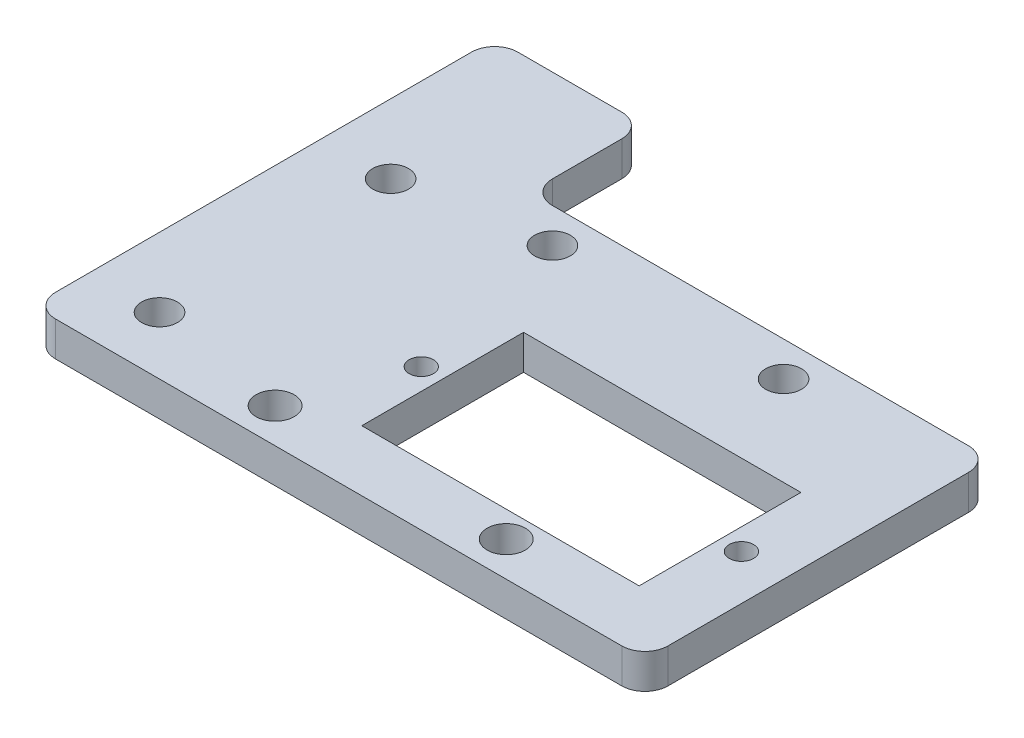
ISO-10303-21;
HEADER;
FILE_DESCRIPTION(('STEP AP214'),'2;1');
FILE_NAME('part.step','',(''),(''),'','','');
FILE_SCHEMA(('AUTOMOTIVE_DESIGN { 1 0 10303 214 1 1 1 1 }'));
ENDSEC;
DATA;
#1=APPLICATION_CONTEXT('core data for automotive mechanical design processes');
#2=APPLICATION_PROTOCOL_DEFINITION('international standard','automotive_design',2000,#1);
#3=PRODUCT_CONTEXT('',#1,'mechanical');
#4=PRODUCT('Part','Part','',(#3));
#5=PRODUCT_RELATED_PRODUCT_CATEGORY('part','',(#4));
#6=PRODUCT_DEFINITION_FORMATION('','',#4);
#7=PRODUCT_DEFINITION_CONTEXT('part definition',#1,'design');
#8=PRODUCT_DEFINITION('design','',#6,#7);
#9=PRODUCT_DEFINITION_SHAPE('','',#8);
#10=(LENGTH_UNIT() NAMED_UNIT(*) SI_UNIT(.MILLI.,.METRE.));
#11=(NAMED_UNIT(*) PLANE_ANGLE_UNIT() SI_UNIT($,.RADIAN.));
#12=(NAMED_UNIT(*) SI_UNIT($,.STERADIAN.) SOLID_ANGLE_UNIT());
#13=UNCERTAINTY_MEASURE_WITH_UNIT(LENGTH_MEASURE(1.E-05),#10,'distance_accuracy_value','');
#14=(GEOMETRIC_REPRESENTATION_CONTEXT(3) GLOBAL_UNCERTAINTY_ASSIGNED_CONTEXT((#13)) GLOBAL_UNIT_ASSIGNED_CONTEXT((#10,
#11,#12)) REPRESENTATION_CONTEXT('',''));
#15=CARTESIAN_POINT('',(0.,0.,0.));
#16=DIRECTION('',(0.,0.,1.));
#17=DIRECTION('',(1.,0.,0.));
#18=AXIS2_PLACEMENT_3D('',#15,#16,#17);
#19=CARTESIAN_POINT('',(26.5,3.,-20.));
#20=DIRECTION('',(-1.,0.,0.));
#21=DIRECTION('',(0.,0.,1.));
#22=AXIS2_PLACEMENT_3D('',#19,#20,#21);
#23=PLANE('',#22);
#24=DIRECTION('',(0.,0.,-1.));
#25=VECTOR('',#24,1.);
#26=CARTESIAN_POINT('',(26.5,3.,-20.));
#27=LINE('',#26,#25);
#28=CARTESIAN_POINT('',(26.5,3.,18.));
#29=VERTEX_POINT('',#28);
#30=CARTESIAN_POINT('',(26.5,3.,-8.00000000000001));
#31=VERTEX_POINT('',#30);
#32=EDGE_CURVE('E224',#29,#31,#27,.T.);
#33=ORIENTED_EDGE('',*,*,#32,.F.);
#34=DIRECTION('',(0.,-1.,0.));
#35=VECTOR('',#34,1.);
#36=CARTESIAN_POINT('',(26.5,3.,18.));
#37=LINE('',#36,#35);
#38=CARTESIAN_POINT('',(26.5,0.,18.));
#39=VERTEX_POINT('',#38);
#40=EDGE_CURVE('E285',#29,#39,#37,.T.);
#41=ORIENTED_EDGE('',*,*,#40,.T.);
#42=DIRECTION('',(0.,0.,-1.));
#43=VECTOR('',#42,1.);
#44=CARTESIAN_POINT('',(26.5,0.,-20.));
#45=LINE('',#44,#43);
#46=CARTESIAN_POINT('',(26.5,0.,-8.00000000000001));
#47=VERTEX_POINT('',#46);
#48=EDGE_CURVE('E223',#39,#47,#45,.T.);
#49=ORIENTED_EDGE('',*,*,#48,.T.);
#50=DIRECTION('',(0.,-1.,0.));
#51=VECTOR('',#50,1.);
#52=CARTESIAN_POINT('',(26.5,3.,-8.00000000000001));
#53=LINE('',#52,#51);
#54=EDGE_CURVE('E283',#47,#31,#53,.F.);
#55=ORIENTED_EDGE('',*,*,#54,.T.);
#56=EDGE_LOOP('',(#33,#41,#49,#55));
#57=FACE_BOUND('',#56,.T.);
#58=ADVANCED_FACE('F39',(#57),#23,.F.);
#59=CARTESIAN_POINT('',(-26.5,3.,-20.));
#60=DIRECTION('',(0.,0.,1.));
#61=DIRECTION('',(1.,0.,0.));
#62=AXIS2_PLACEMENT_3D('',#59,#60,#61);
#63=PLANE('',#62);
#64=DIRECTION('',(-1.,0.,0.));
#65=VECTOR('',#64,1.);
#66=CARTESIAN_POINT('',(-26.5,3.,-20.));
#67=LINE('',#66,#65);
#68=CARTESIAN_POINT('',(-15.5,3.,-20.));
#69=VERTEX_POINT('',#68);
#70=CARTESIAN_POINT('',(-24.5,3.,-20.));
#71=VERTEX_POINT('',#70);
#72=EDGE_CURVE('E226',#69,#71,#67,.T.);
#73=ORIENTED_EDGE('',*,*,#72,.F.);
#74=DIRECTION('',(0.,-1.,0.));
#75=VECTOR('',#74,1.);
#76=CARTESIAN_POINT('',(-15.5,3.,-20.));
#77=LINE('',#76,#75);
#78=CARTESIAN_POINT('',(-15.5,0.,-20.));
#79=VERTEX_POINT('',#78);
#80=EDGE_CURVE('E299',#69,#79,#77,.T.);
#81=ORIENTED_EDGE('',*,*,#80,.T.);
#82=DIRECTION('',(-1.,0.,0.));
#83=VECTOR('',#82,1.);
#84=CARTESIAN_POINT('',(-26.5,0.,-20.));
#85=LINE('',#84,#83);
#86=CARTESIAN_POINT('',(-24.5,0.,-20.));
#87=VERTEX_POINT('',#86);
#88=EDGE_CURVE('E239',#79,#87,#85,.T.);
#89=ORIENTED_EDGE('',*,*,#88,.T.);
#90=DIRECTION('',(0.,-1.,0.));
#91=VECTOR('',#90,1.);
#92=CARTESIAN_POINT('',(-24.5,3.,-20.));
#93=LINE('',#92,#91);
#94=EDGE_CURVE('E297',#87,#71,#93,.F.);
#95=ORIENTED_EDGE('',*,*,#94,.T.);
#96=EDGE_LOOP('',(#73,#81,#89,#95));
#97=FACE_BOUND('',#96,.T.);
#98=ADVANCED_FACE('F364',(#97),#63,.F.);
#99=CARTESIAN_POINT('',(-26.5,3.,-20.));
#100=DIRECTION('',(1.,0.,0.));
#101=DIRECTION('',(0.,0.,-1.));
#102=AXIS2_PLACEMENT_3D('',#99,#100,#101);
#103=PLANE('',#102);
#104=DIRECTION('',(0.,0.,1.));
#105=VECTOR('',#104,1.);
#106=CARTESIAN_POINT('',(-26.5,0.,-20.));
#107=LINE('',#106,#105);
#108=CARTESIAN_POINT('',(-26.5,0.,-18.));
#109=VERTEX_POINT('',#108);
#110=CARTESIAN_POINT('',(-26.5,0.,18.));
#111=VERTEX_POINT('',#110);
#112=EDGE_CURVE('E242',#109,#111,#107,.T.);
#113=ORIENTED_EDGE('',*,*,#112,.T.);
#114=DIRECTION('',(0.,-1.,0.));
#115=VECTOR('',#114,1.);
#116=CARTESIAN_POINT('',(-26.5,3.,18.));
#117=LINE('',#116,#115);
#118=CARTESIAN_POINT('',(-26.5,3.,18.));
#119=VERTEX_POINT('',#118);
#120=EDGE_CURVE('E272',#111,#119,#117,.F.);
#121=ORIENTED_EDGE('',*,*,#120,.T.);
#122=DIRECTION('',(0.,0.,1.));
#123=VECTOR('',#122,1.);
#124=CARTESIAN_POINT('',(-26.5,3.,-20.));
#125=LINE('',#124,#123);
#126=CARTESIAN_POINT('',(-26.5,3.,-18.));
#127=VERTEX_POINT('',#126);
#128=EDGE_CURVE('E230',#127,#119,#125,.T.);
#129=ORIENTED_EDGE('',*,*,#128,.F.);
#130=DIRECTION('',(0.,-1.,0.));
#131=VECTOR('',#130,1.);
#132=CARTESIAN_POINT('',(-26.5,3.,-18.));
#133=LINE('',#132,#131);
#134=EDGE_CURVE('E269',#127,#109,#133,.T.);
#135=ORIENTED_EDGE('',*,*,#134,.T.);
#136=EDGE_LOOP('',(#113,#121,#129,#135));
#137=FACE_BOUND('',#136,.T.);
#138=ADVANCED_FACE('F371',(#137),#103,.F.);
#139=CARTESIAN_POINT('',(-26.5,3.,20.));
#140=DIRECTION('',(0.,0.,-1.));
#141=DIRECTION('',(-1.,0.,0.));
#142=AXIS2_PLACEMENT_3D('',#139,#140,#141);
#143=PLANE('',#142);
#144=DIRECTION('',(1.,0.,0.));
#145=VECTOR('',#144,1.);
#146=CARTESIAN_POINT('',(-26.5,3.,20.));
#147=LINE('',#146,#145);
#148=CARTESIAN_POINT('',(-24.5,3.,20.));
#149=VERTEX_POINT('',#148);
#150=CARTESIAN_POINT('',(24.5,3.,20.));
#151=VERTEX_POINT('',#150);
#152=EDGE_CURVE('E233',#149,#151,#147,.T.);
#153=ORIENTED_EDGE('',*,*,#152,.F.);
#154=DIRECTION('',(0.,-1.,0.));
#155=VECTOR('',#154,1.);
#156=CARTESIAN_POINT('',(-24.5,3.,20.));
#157=LINE('',#156,#155);
#158=CARTESIAN_POINT('',(-24.5,0.,20.));
#159=VERTEX_POINT('',#158);
#160=EDGE_CURVE('E256',#149,#159,#157,.T.);
#161=ORIENTED_EDGE('',*,*,#160,.T.);
#162=DIRECTION('',(1.,0.,0.));
#163=VECTOR('',#162,1.);
#164=CARTESIAN_POINT('',(-26.5,0.,20.));
#165=LINE('',#164,#163);
#166=CARTESIAN_POINT('',(24.5,0.,20.));
#167=VERTEX_POINT('',#166);
#168=EDGE_CURVE('E227',#159,#167,#165,.T.);
#169=ORIENTED_EDGE('',*,*,#168,.T.);
#170=DIRECTION('',(0.,-1.,0.));
#171=VECTOR('',#170,1.);
#172=CARTESIAN_POINT('',(24.5,3.,20.));
#173=LINE('',#172,#171);
#174=EDGE_CURVE('E236',#167,#151,#173,.F.);
#175=ORIENTED_EDGE('',*,*,#174,.T.);
#176=EDGE_LOOP('',(#153,#161,#169,#175));
#177=FACE_BOUND('',#176,.T.);
#178=ADVANCED_FACE('F411',(#177),#143,.F.);
#179=CARTESIAN_POINT('',(0.,3.,0.));
#180=DIRECTION('',(0.,1.,0.));
#181=DIRECTION('',(0.,0.,1.));
#182=AXIS2_PLACEMENT_3D('',#179,#180,#181);
#183=PLANE('',#182);
#184=CARTESIAN_POINT('',(11.5,3.,-7.00000000000001));
#185=DIRECTION('',(0.,1.,0.));
#186=DIRECTION('',(0.,0.,1.));
#187=AXIS2_PLACEMENT_3D('',#184,#185,#186);
#188=CIRCLE('',#187,1.55);
#189=CARTESIAN_POINT('',(11.5,3.,-5.45000000000001));
#190=VERTEX_POINT('',#189);
#191=EDGE_CURVE('E312',#190,#190,#188,.T.);
#192=ORIENTED_EDGE('',*,*,#191,.F.);
#193=EDGE_LOOP('',(#192));
#194=FACE_BOUND('',#193,.T.);
#195=CARTESIAN_POINT('',(-8.5,3.,-7.00000000000001));
#196=DIRECTION('',(0.,1.,0.));
#197=DIRECTION('',(0.,0.,1.));
#198=AXIS2_PLACEMENT_3D('',#195,#196,#197);
#199=CIRCLE('',#198,1.55);
#200=CARTESIAN_POINT('',(-8.5,3.,-5.45000000000001));
#201=VERTEX_POINT('',#200);
#202=EDGE_CURVE('E332',#201,#201,#199,.T.);
#203=ORIENTED_EDGE('',*,*,#202,.F.);
#204=EDGE_LOOP('',(#203));
#205=FACE_BOUND('',#204,.T.);
#206=ORIENTED_EDGE('',*,*,#128,.T.);
#207=CARTESIAN_POINT('',(-24.5,3.,18.));
#208=DIRECTION('',(0.,1.,0.));
#209=DIRECTION('',(0.,0.,1.));
#210=AXIS2_PLACEMENT_3D('',#207,#208,#209);
#211=CIRCLE('',#210,2.);
#212=EDGE_CURVE('E281',#119,#149,#211,.T.);
#213=ORIENTED_EDGE('',*,*,#212,.T.);
#214=ORIENTED_EDGE('',*,*,#152,.T.);
#215=CARTESIAN_POINT('',(24.5,3.,18.));
#216=DIRECTION('',(0.,1.,0.));
#217=DIRECTION('',(0.,0.,1.));
#218=AXIS2_PLACEMENT_3D('',#215,#216,#217);
#219=CIRCLE('',#218,2.);
#220=EDGE_CURVE('E279',#151,#29,#219,.T.);
#221=ORIENTED_EDGE('',*,*,#220,.T.);
#222=ORIENTED_EDGE('',*,*,#32,.T.);
#223=CARTESIAN_POINT('',(24.5,3.,-8.00000000000001));
#224=DIRECTION('',(0.,1.,0.));
#225=DIRECTION('',(0.,0.,1.));
#226=AXIS2_PLACEMENT_3D('',#223,#224,#225);
#227=CIRCLE('',#226,2.);
#228=CARTESIAN_POINT('',(24.5,3.,-10.));
#229=VERTEX_POINT('',#228);
#230=EDGE_CURVE('E54',#31,#229,#227,.T.);
#231=ORIENTED_EDGE('',*,*,#230,.T.);
#232=DIRECTION('',(1.,0.,0.));
#233=VECTOR('',#232,1.);
#234=CARTESIAN_POINT('',(0.,3.,-10.));
#235=LINE('',#234,#233);
#236=CARTESIAN_POINT('',(-11.5,3.,-10.));
#237=VERTEX_POINT('',#236);
#238=EDGE_CURVE('E322',#237,#229,#235,.T.);
#239=ORIENTED_EDGE('',*,*,#238,.F.);
#240=CARTESIAN_POINT('',(-11.5,3.,-12.));
#241=DIRECTION('',(0.,1.,0.));
#242=DIRECTION('',(0.,0.,1.));
#243=AXIS2_PLACEMENT_3D('',#240,#241,#242);
#244=CIRCLE('',#243,2.);
#245=CARTESIAN_POINT('',(-13.5,3.,-12.));
#246=VERTEX_POINT('',#245);
#247=EDGE_CURVE('E11',#237,#246,#244,.F.);
#248=ORIENTED_EDGE('',*,*,#247,.T.);
#249=DIRECTION('',(0.,0.,1.));
#250=VECTOR('',#249,1.);
#251=CARTESIAN_POINT('',(-13.5,3.,0.));
#252=LINE('',#251,#250);
#253=CARTESIAN_POINT('',(-13.5,3.,-18.));
#254=VERTEX_POINT('',#253);
#255=EDGE_CURVE('E320',#254,#246,#252,.T.);
#256=ORIENTED_EDGE('',*,*,#255,.F.);
#257=CARTESIAN_POINT('',(-15.5,3.,-18.));
#258=DIRECTION('',(0.,1.,0.));
#259=DIRECTION('',(0.,0.,1.));
#260=AXIS2_PLACEMENT_3D('',#257,#258,#259);
#261=CIRCLE('',#260,2.);
#262=EDGE_CURVE('E276',#254,#69,#261,.T.);
#263=ORIENTED_EDGE('',*,*,#262,.T.);
#264=ORIENTED_EDGE('',*,*,#72,.T.);
#265=CARTESIAN_POINT('',(-24.5,3.,-18.));
#266=DIRECTION('',(0.,1.,0.));
#267=DIRECTION('',(0.,0.,1.));
#268=AXIS2_PLACEMENT_3D('',#265,#266,#267);
#269=CIRCLE('',#268,2.);
#270=EDGE_CURVE('E274',#71,#127,#269,.T.);
#271=ORIENTED_EDGE('',*,*,#270,.T.);
#272=EDGE_LOOP('',(#206,#213,#214,#221,#222,#231,#239,#248,#256,#263,#264,#271));
#273=FACE_BOUND('',#272,.T.);
#274=DIRECTION('',(0.,0.,1.));
#275=VECTOR('',#274,1.);
#276=CARTESIAN_POINT('',(-3.250025,3.,0.));
#277=LINE('',#276,#275);
#278=CARTESIAN_POINT('',(-3.250025,3.,0.749999999999699));
#279=VERTEX_POINT('',#278);
#280=CARTESIAN_POINT('',(-3.25002500000001,3.,14.7499999999997));
#281=VERTEX_POINT('',#280);
#282=EDGE_CURVE('E193',#279,#281,#277,.T.);
#283=ORIENTED_EDGE('',*,*,#282,.F.);
#284=DIRECTION('',(-1.,0.,0.));
#285=VECTOR('',#284,1.);
#286=CARTESIAN_POINT('',(0.,3.,0.749999999999699));
#287=LINE('',#286,#285);
#288=CARTESIAN_POINT('',(20.749975,3.,0.749999999999699));
#289=VERTEX_POINT('',#288);
#290=EDGE_CURVE('E186',#289,#279,#287,.T.);
#291=ORIENTED_EDGE('',*,*,#290,.F.);
#292=DIRECTION('',(0.,0.,-1.));
#293=VECTOR('',#292,1.);
#294=CARTESIAN_POINT('',(20.749975,3.,0.));
#295=LINE('',#294,#293);
#296=CARTESIAN_POINT('',(20.749975,3.,14.7499999999997));
#297=VERTEX_POINT('',#296);
#298=EDGE_CURVE('E161',#297,#289,#295,.T.);
#299=ORIENTED_EDGE('',*,*,#298,.F.);
#300=DIRECTION('',(1.,0.,0.));
#301=VECTOR('',#300,1.);
#302=CARTESIAN_POINT('',(0.,3.,14.7499999999997));
#303=LINE('',#302,#301);
#304=EDGE_CURVE('E191',#281,#297,#303,.T.);
#305=ORIENTED_EDGE('',*,*,#304,.F.);
#306=EDGE_LOOP('',(#283,#291,#299,#305));
#307=FACE_BOUND('',#306,.T.);
#308=CARTESIAN_POINT('',(22.599975,3.,7.74999999999999));
#309=DIRECTION('',(0.,1.,0.));
#310=DIRECTION('',(0.,0.,1.));
#311=AXIS2_PLACEMENT_3D('',#308,#309,#310);
#312=CIRCLE('',#311,1.05);
#313=CARTESIAN_POINT('',(22.599975,3.,8.79999999999999));
#314=VERTEX_POINT('',#313);
#315=EDGE_CURVE('E196',#314,#314,#312,.T.);
#316=ORIENTED_EDGE('',*,*,#315,.F.);
#317=EDGE_LOOP('',(#316));
#318=FACE_BOUND('',#317,.T.);
#319=CARTESIAN_POINT('',(-5.10002500000002,3.,7.74999999999999));
#320=DIRECTION('',(0.,1.,0.));
#321=DIRECTION('',(0.,0.,1.));
#322=AXIS2_PLACEMENT_3D('',#319,#320,#321);
#323=CIRCLE('',#322,1.05);
#324=CARTESIAN_POINT('',(-5.10002500000002,3.,8.79999999999999));
#325=VERTEX_POINT('',#324);
#326=EDGE_CURVE('E195',#325,#325,#323,.T.);
#327=ORIENTED_EDGE('',*,*,#326,.F.);
#328=EDGE_LOOP('',(#327));
#329=FACE_BOUND('',#328,.T.);
#330=CARTESIAN_POINT('',(-8.49999999999999,3.,17.));
#331=DIRECTION('',(0.,1.,0.));
#332=DIRECTION('',(0.,0.,1.));
#333=AXIS2_PLACEMENT_3D('',#330,#331,#332);
#334=CIRCLE('',#333,1.65);
#335=CARTESIAN_POINT('',(-8.49999999999999,3.,18.65));
#336=VERTEX_POINT('',#335);
#337=EDGE_CURVE('E202',#336,#336,#334,.T.);
#338=ORIENTED_EDGE('',*,*,#337,.F.);
#339=EDGE_LOOP('',(#338));
#340=FACE_BOUND('',#339,.T.);
#341=CARTESIAN_POINT('',(11.5,3.,17.));
#342=DIRECTION('',(0.,1.,0.));
#343=DIRECTION('',(0.,0.,1.));
#344=AXIS2_PLACEMENT_3D('',#341,#342,#343);
#345=CIRCLE('',#344,1.65);
#346=CARTESIAN_POINT('',(11.5,3.,18.65));
#347=VERTEX_POINT('',#346);
#348=EDGE_CURVE('E206',#347,#347,#345,.T.);
#349=ORIENTED_EDGE('',*,*,#348,.F.);
#350=EDGE_LOOP('',(#349));
#351=FACE_BOUND('',#350,.T.);
#352=CARTESIAN_POINT('',(-20.5,3.,15.));
#353=DIRECTION('',(0.,1.,0.));
#354=DIRECTION('',(0.,0.,1.));
#355=AXIS2_PLACEMENT_3D('',#352,#353,#354);
#356=CIRCLE('',#355,1.55);
#357=CARTESIAN_POINT('',(-20.5,3.,16.55));
#358=VERTEX_POINT('',#357);
#359=EDGE_CURVE('E220',#358,#358,#356,.T.);
#360=ORIENTED_EDGE('',*,*,#359,.F.);
#361=EDGE_LOOP('',(#360));
#362=FACE_BOUND('',#361,.T.);
#363=CARTESIAN_POINT('',(-20.5,3.,-5.00000000000001));
#364=DIRECTION('',(0.,1.,0.));
#365=DIRECTION('',(0.,0.,1.));
#366=AXIS2_PLACEMENT_3D('',#363,#364,#365);
#367=CIRCLE('',#366,1.55);
#368=CARTESIAN_POINT('',(-20.5,3.,-3.45000000000001));
#369=VERTEX_POINT('',#368);
#370=EDGE_CURVE('E213',#369,#369,#367,.T.);
#371=ORIENTED_EDGE('',*,*,#370,.F.);
#372=EDGE_LOOP('',(#371));
#373=FACE_BOUND('',#372,.T.);
#374=ADVANCED_FACE('F318',(#194,#205,#273,#307,#318,#329,#340,#351,#362,#373),#183,.T.);
#375=CARTESIAN_POINT('',(0.,0.,0.));
#376=DIRECTION('',(0.,1.,0.));
#377=DIRECTION('',(0.,0.,1.));
#378=AXIS2_PLACEMENT_3D('',#375,#376,#377);
#379=PLANE('',#378);
#380=CARTESIAN_POINT('',(11.5,0.,-7.00000000000001));
#381=DIRECTION('',(0.,-1.,0.));
#382=DIRECTION('',(0.,0.,-1.));
#383=AXIS2_PLACEMENT_3D('',#380,#381,#382);
#384=CIRCLE('',#383,1.55);
#385=CARTESIAN_POINT('',(11.5,0.,-8.55000000000001));
#386=VERTEX_POINT('',#385);
#387=EDGE_CURVE('E335',#386,#386,#384,.T.);
#388=ORIENTED_EDGE('',*,*,#387,.F.);
#389=EDGE_LOOP('',(#388));
#390=FACE_BOUND('',#389,.T.);
#391=CARTESIAN_POINT('',(-8.5,0.,-7.00000000000001));
#392=DIRECTION('',(0.,-1.,0.));
#393=DIRECTION('',(0.,0.,-1.));
#394=AXIS2_PLACEMENT_3D('',#391,#392,#393);
#395=CIRCLE('',#394,1.55);
#396=CARTESIAN_POINT('',(-8.5,0.,-8.55000000000001));
#397=VERTEX_POINT('',#396);
#398=EDGE_CURVE('E336',#397,#397,#395,.T.);
#399=ORIENTED_EDGE('',*,*,#398,.F.);
#400=EDGE_LOOP('',(#399));
#401=FACE_BOUND('',#400,.T.);
#402=DIRECTION('',(1.,0.,0.));
#403=VECTOR('',#402,1.);
#404=CARTESIAN_POINT('',(20.749975,0.,0.749999999999699));
#405=LINE('',#404,#403);
#406=CARTESIAN_POINT('',(-3.250025,0.,0.749999999999699));
#407=VERTEX_POINT('',#406);
#408=CARTESIAN_POINT('',(20.749975,0.,0.749999999999699));
#409=VERTEX_POINT('',#408);
#410=EDGE_CURVE('E169',#407,#409,#405,.T.);
#411=ORIENTED_EDGE('',*,*,#410,.F.);
#412=DIRECTION('',(0.,0.,-1.));
#413=VECTOR('',#412,1.);
#414=CARTESIAN_POINT('',(-3.250025,0.,0.749999999999699));
#415=LINE('',#414,#413);
#416=CARTESIAN_POINT('',(-3.25002500000001,0.,14.7499999999997));
#417=VERTEX_POINT('',#416);
#418=EDGE_CURVE('E174',#417,#407,#415,.T.);
#419=ORIENTED_EDGE('',*,*,#418,.F.);
#420=DIRECTION('',(-1.,0.,0.));
#421=VECTOR('',#420,1.);
#422=CARTESIAN_POINT('',(20.749975,0.,14.7499999999997));
#423=LINE('',#422,#421);
#424=CARTESIAN_POINT('',(20.749975,0.,14.7499999999997));
#425=VERTEX_POINT('',#424);
#426=EDGE_CURVE('E179',#425,#417,#423,.T.);
#427=ORIENTED_EDGE('',*,*,#426,.F.);
#428=DIRECTION('',(0.,0.,1.));
#429=VECTOR('',#428,1.);
#430=CARTESIAN_POINT('',(20.749975,0.,0.749999999999699));
#431=LINE('',#430,#429);
#432=EDGE_CURVE('E158',#409,#425,#431,.T.);
#433=ORIENTED_EDGE('',*,*,#432,.F.);
#434=EDGE_LOOP('',(#411,#419,#427,#433));
#435=FACE_BOUND('',#434,.T.);
#436=CARTESIAN_POINT('',(22.599975,0.,7.74999999999999));
#437=DIRECTION('',(0.,1.,0.));
#438=DIRECTION('',(0.,0.,1.));
#439=AXIS2_PLACEMENT_3D('',#436,#437,#438);
#440=CIRCLE('',#439,1.05);
#441=CARTESIAN_POINT('',(22.599975,0.,8.79999999999999));
#442=VERTEX_POINT('',#441);
#443=EDGE_CURVE('E209',#442,#442,#440,.T.);
#444=ORIENTED_EDGE('',*,*,#443,.T.);
#445=EDGE_LOOP('',(#444));
#446=FACE_BOUND('',#445,.T.);
#447=CARTESIAN_POINT('',(-5.10002500000002,0.,7.74999999999999));
#448=DIRECTION('',(0.,1.,0.));
#449=DIRECTION('',(0.,0.,1.));
#450=AXIS2_PLACEMENT_3D('',#447,#448,#449);
#451=CIRCLE('',#450,1.05);
#452=CARTESIAN_POINT('',(-5.10002500000002,0.,8.79999999999999));
#453=VERTEX_POINT('',#452);
#454=EDGE_CURVE('E199',#453,#453,#451,.T.);
#455=ORIENTED_EDGE('',*,*,#454,.T.);
#456=EDGE_LOOP('',(#455));
#457=FACE_BOUND('',#456,.T.);
#458=CARTESIAN_POINT('',(-8.49999999999999,0.,17.));
#459=DIRECTION('',(0.,1.,0.));
#460=DIRECTION('',(0.,0.,1.));
#461=AXIS2_PLACEMENT_3D('',#458,#459,#460);
#462=CIRCLE('',#461,1.65);
#463=CARTESIAN_POINT('',(-8.49999999999999,0.,18.65));
#464=VERTEX_POINT('',#463);
#465=EDGE_CURVE('E217',#464,#464,#462,.T.);
#466=ORIENTED_EDGE('',*,*,#465,.T.);
#467=EDGE_LOOP('',(#466));
#468=FACE_BOUND('',#467,.T.);
#469=CARTESIAN_POINT('',(11.5,0.,17.));
#470=DIRECTION('',(0.,1.,0.));
#471=DIRECTION('',(0.,0.,1.));
#472=AXIS2_PLACEMENT_3D('',#469,#470,#471);
#473=CIRCLE('',#472,1.65);
#474=CARTESIAN_POINT('',(11.5,0.,18.65));
#475=VERTEX_POINT('',#474);
#476=EDGE_CURVE('E205',#475,#475,#473,.T.);
#477=ORIENTED_EDGE('',*,*,#476,.T.);
#478=EDGE_LOOP('',(#477));
#479=FACE_BOUND('',#478,.T.);
#480=CARTESIAN_POINT('',(-20.5,0.,15.));
#481=DIRECTION('',(0.,-1.,0.));
#482=DIRECTION('',(0.,0.,-1.));
#483=AXIS2_PLACEMENT_3D('',#480,#481,#482);
#484=CIRCLE('',#483,1.55);
#485=CARTESIAN_POINT('',(-20.5,0.,13.45));
#486=VERTEX_POINT('',#485);
#487=EDGE_CURVE('E210',#486,#486,#484,.T.);
#488=ORIENTED_EDGE('',*,*,#487,.F.);
#489=EDGE_LOOP('',(#488));
#490=FACE_BOUND('',#489,.T.);
#491=CARTESIAN_POINT('',(-20.5,0.,-5.00000000000001));
#492=DIRECTION('',(0.,-1.,0.));
#493=DIRECTION('',(0.,0.,-1.));
#494=AXIS2_PLACEMENT_3D('',#491,#492,#493);
#495=CIRCLE('',#494,1.55);
#496=CARTESIAN_POINT('',(-20.5,0.,-6.55000000000001));
#497=VERTEX_POINT('',#496);
#498=EDGE_CURVE('E214',#497,#497,#495,.T.);
#499=ORIENTED_EDGE('',*,*,#498,.F.);
#500=EDGE_LOOP('',(#499));
#501=FACE_BOUND('',#500,.T.);
#502=ORIENTED_EDGE('',*,*,#168,.F.);
#503=CARTESIAN_POINT('',(-24.5,0.,18.));
#504=DIRECTION('',(0.,1.,0.));
#505=DIRECTION('',(0.,0.,1.));
#506=AXIS2_PLACEMENT_3D('',#503,#504,#505);
#507=CIRCLE('',#506,2.);
#508=EDGE_CURVE('E267',#159,#111,#507,.F.);
#509=ORIENTED_EDGE('',*,*,#508,.T.);
#510=ORIENTED_EDGE('',*,*,#112,.F.);
#511=CARTESIAN_POINT('',(-24.5,0.,-18.));
#512=DIRECTION('',(0.,1.,0.));
#513=DIRECTION('',(0.,0.,1.));
#514=AXIS2_PLACEMENT_3D('',#511,#512,#513);
#515=CIRCLE('',#514,2.);
#516=EDGE_CURVE('E259',#109,#87,#515,.F.);
#517=ORIENTED_EDGE('',*,*,#516,.T.);
#518=ORIENTED_EDGE('',*,*,#88,.F.);
#519=CARTESIAN_POINT('',(-15.5,0.,-18.));
#520=DIRECTION('',(0.,1.,0.));
#521=DIRECTION('',(0.,0.,1.));
#522=AXIS2_PLACEMENT_3D('',#519,#520,#521);
#523=CIRCLE('',#522,2.);
#524=CARTESIAN_POINT('',(-13.5,0.,-18.));
#525=VERTEX_POINT('',#524);
#526=EDGE_CURVE('E261',#79,#525,#523,.F.);
#527=ORIENTED_EDGE('',*,*,#526,.T.);
#528=DIRECTION('',(0.,0.,-1.));
#529=VECTOR('',#528,1.);
#530=CARTESIAN_POINT('',(-13.5,0.,-20.));
#531=LINE('',#530,#529);
#532=CARTESIAN_POINT('',(-13.5,0.,-12.));
#533=VERTEX_POINT('',#532);
#534=EDGE_CURVE('E307',#533,#525,#531,.T.);
#535=ORIENTED_EDGE('',*,*,#534,.F.);
#536=CARTESIAN_POINT('',(-11.5,0.,-12.));
#537=DIRECTION('',(0.,1.,0.));
#538=DIRECTION('',(0.,0.,1.));
#539=AXIS2_PLACEMENT_3D('',#536,#537,#538);
#540=CIRCLE('',#539,2.);
#541=CARTESIAN_POINT('',(-11.5,0.,-10.));
#542=VERTEX_POINT('',#541);
#543=EDGE_CURVE('E47',#533,#542,#540,.T.);
#544=ORIENTED_EDGE('',*,*,#543,.T.);
#545=DIRECTION('',(-1.,0.,0.));
#546=VECTOR('',#545,1.);
#547=CARTESIAN_POINT('',(26.5,0.,-10.));
#548=LINE('',#547,#546);
#549=CARTESIAN_POINT('',(24.5,0.,-10.));
#550=VERTEX_POINT('',#549);
#551=EDGE_CURVE('E305',#550,#542,#548,.T.);
#552=ORIENTED_EDGE('',*,*,#551,.F.);
#553=CARTESIAN_POINT('',(24.5,0.,-8.00000000000001));
#554=DIRECTION('',(0.,1.,0.));
#555=DIRECTION('',(0.,0.,1.));
#556=AXIS2_PLACEMENT_3D('',#553,#554,#555);
#557=CIRCLE('',#556,2.);
#558=EDGE_CURVE('E263',#550,#47,#557,.F.);
#559=ORIENTED_EDGE('',*,*,#558,.T.);
#560=ORIENTED_EDGE('',*,*,#48,.F.);
#561=CARTESIAN_POINT('',(24.5,0.,18.));
#562=DIRECTION('',(0.,1.,0.));
#563=DIRECTION('',(0.,0.,1.));
#564=AXIS2_PLACEMENT_3D('',#561,#562,#563);
#565=CIRCLE('',#564,2.);
#566=EDGE_CURVE('E265',#39,#167,#565,.F.);
#567=ORIENTED_EDGE('',*,*,#566,.T.);
#568=EDGE_LOOP('',(#502,#509,#510,#517,#518,#527,#535,#544,#552,#559,#560,#567));
#569=FACE_BOUND('',#568,.T.);
#570=ADVANCED_FACE('F176',(#390,#401,#435,#446,#457,#468,#479,#490,#501,#569),#379,.F.);
#571=CARTESIAN_POINT('',(-20.5,10.,-5.00000000000001));
#572=DIRECTION('',(0.,-1.,0.));
#573=DIRECTION('',(0.,0.,-1.));
#574=AXIS2_PLACEMENT_3D('',#571,#572,#573);
#575=CYLINDRICAL_SURFACE('',#574,1.55);
#576=ORIENTED_EDGE('',*,*,#370,.T.);
#577=EDGE_LOOP('',(#576));
#578=FACE_BOUND('',#577,.T.);
#579=ORIENTED_EDGE('',*,*,#498,.T.);
#580=EDGE_LOOP('',(#579));
#581=FACE_BOUND('',#580,.T.);
#582=ADVANCED_FACE('F346',(#578,#581),#575,.F.);
#583=CARTESIAN_POINT('',(-20.5,10.,15.));
#584=DIRECTION('',(0.,-1.,0.));
#585=DIRECTION('',(0.,0.,-1.));
#586=AXIS2_PLACEMENT_3D('',#583,#584,#585);
#587=CYLINDRICAL_SURFACE('',#586,1.55);
#588=ORIENTED_EDGE('',*,*,#359,.T.);
#589=EDGE_LOOP('',(#588));
#590=FACE_BOUND('',#589,.T.);
#591=ORIENTED_EDGE('',*,*,#487,.T.);
#592=EDGE_LOOP('',(#591));
#593=FACE_BOUND('',#592,.T.);
#594=ADVANCED_FACE('F427',(#590,#593),#587,.F.);
#595=CARTESIAN_POINT('',(11.5,-7.,17.));
#596=DIRECTION('',(0.,1.,0.));
#597=DIRECTION('',(0.,0.,1.));
#598=AXIS2_PLACEMENT_3D('',#595,#596,#597);
#599=CYLINDRICAL_SURFACE('',#598,1.65);
#600=ORIENTED_EDGE('',*,*,#348,.T.);
#601=EDGE_LOOP('',(#600));
#602=FACE_BOUND('',#601,.T.);
#603=ORIENTED_EDGE('',*,*,#476,.F.);
#604=EDGE_LOOP('',(#603));
#605=FACE_BOUND('',#604,.T.);
#606=ADVANCED_FACE('F431',(#602,#605),#599,.F.);
#607=CARTESIAN_POINT('',(-8.49999999999999,-7.,17.));
#608=DIRECTION('',(0.,1.,0.));
#609=DIRECTION('',(0.,0.,1.));
#610=AXIS2_PLACEMENT_3D('',#607,#608,#609);
#611=CYLINDRICAL_SURFACE('',#610,1.65);
#612=ORIENTED_EDGE('',*,*,#337,.T.);
#613=EDGE_LOOP('',(#612));
#614=FACE_BOUND('',#613,.T.);
#615=ORIENTED_EDGE('',*,*,#465,.F.);
#616=EDGE_LOOP('',(#615));
#617=FACE_BOUND('',#616,.T.);
#618=ADVANCED_FACE('F435',(#614,#617),#611,.F.);
#619=CARTESIAN_POINT('',(-5.10002500000002,-7.,7.74999999999999));
#620=DIRECTION('',(0.,1.,0.));
#621=DIRECTION('',(0.,0.,1.));
#622=AXIS2_PLACEMENT_3D('',#619,#620,#621);
#623=CYLINDRICAL_SURFACE('',#622,1.05);
#624=ORIENTED_EDGE('',*,*,#326,.T.);
#625=EDGE_LOOP('',(#624));
#626=FACE_BOUND('',#625,.T.);
#627=ORIENTED_EDGE('',*,*,#454,.F.);
#628=EDGE_LOOP('',(#627));
#629=FACE_BOUND('',#628,.T.);
#630=ADVANCED_FACE('F439',(#626,#629),#623,.F.);
#631=CARTESIAN_POINT('',(22.599975,-7.,7.74999999999999));
#632=DIRECTION('',(0.,1.,0.));
#633=DIRECTION('',(0.,0.,1.));
#634=AXIS2_PLACEMENT_3D('',#631,#632,#633);
#635=CYLINDRICAL_SURFACE('',#634,1.05);
#636=ORIENTED_EDGE('',*,*,#315,.T.);
#637=EDGE_LOOP('',(#636));
#638=FACE_BOUND('',#637,.T.);
#639=ORIENTED_EDGE('',*,*,#443,.F.);
#640=EDGE_LOOP('',(#639));
#641=FACE_BOUND('',#640,.T.);
#642=ADVANCED_FACE('F443',(#638,#641),#635,.F.);
#643=CARTESIAN_POINT('',(-3.250025,10.,0.749999999999699));
#644=DIRECTION('',(-1.,0.,0.));
#645=DIRECTION('',(0.,0.,1.));
#646=AXIS2_PLACEMENT_3D('',#643,#644,#645);
#647=PLANE('',#646);
#648=ORIENTED_EDGE('',*,*,#282,.T.);
#649=DIRECTION('',(0.,-1.,0.));
#650=VECTOR('',#649,1.);
#651=CARTESIAN_POINT('',(-3.25002500000001,10.,14.7499999999997));
#652=LINE('',#651,#650);
#653=EDGE_CURVE('E184',#281,#417,#652,.T.);
#654=ORIENTED_EDGE('',*,*,#653,.T.);
#655=ORIENTED_EDGE('',*,*,#418,.T.);
#656=DIRECTION('',(0.,-1.,0.));
#657=VECTOR('',#656,1.);
#658=CARTESIAN_POINT('',(-3.250025,10.,0.749999999999699));
#659=LINE('',#658,#657);
#660=EDGE_CURVE('E165',#279,#407,#659,.T.);
#661=ORIENTED_EDGE('',*,*,#660,.F.);
#662=EDGE_LOOP('',(#648,#654,#655,#661));
#663=FACE_BOUND('',#662,.T.);
#664=ADVANCED_FACE('F447',(#663),#647,.F.);
#665=CARTESIAN_POINT('',(20.749975,10.,14.7499999999997));
#666=DIRECTION('',(0.,0.,1.));
#667=DIRECTION('',(1.,0.,0.));
#668=AXIS2_PLACEMENT_3D('',#665,#666,#667);
#669=PLANE('',#668);
#670=ORIENTED_EDGE('',*,*,#304,.T.);
#671=DIRECTION('',(0.,-1.,0.));
#672=VECTOR('',#671,1.);
#673=CARTESIAN_POINT('',(20.749975,10.,14.7499999999997));
#674=LINE('',#673,#672);
#675=EDGE_CURVE('E164',#297,#425,#674,.T.);
#676=ORIENTED_EDGE('',*,*,#675,.T.);
#677=ORIENTED_EDGE('',*,*,#426,.T.);
#678=ORIENTED_EDGE('',*,*,#653,.F.);
#679=EDGE_LOOP('',(#670,#676,#677,#678));
#680=FACE_BOUND('',#679,.T.);
#681=ADVANCED_FACE('F451',(#680),#669,.F.);
#682=CARTESIAN_POINT('',(20.749975,10.,0.749999999999699));
#683=DIRECTION('',(1.,0.,0.));
#684=DIRECTION('',(0.,0.,-1.));
#685=AXIS2_PLACEMENT_3D('',#682,#683,#684);
#686=PLANE('',#685);
#687=ORIENTED_EDGE('',*,*,#298,.T.);
#688=DIRECTION('',(0.,-1.,0.));
#689=VECTOR('',#688,1.);
#690=CARTESIAN_POINT('',(20.749975,10.,0.749999999999699));
#691=LINE('',#690,#689);
#692=EDGE_CURVE('E153',#289,#409,#691,.T.);
#693=ORIENTED_EDGE('',*,*,#692,.T.);
#694=ORIENTED_EDGE('',*,*,#432,.T.);
#695=ORIENTED_EDGE('',*,*,#675,.F.);
#696=EDGE_LOOP('',(#687,#693,#694,#695));
#697=FACE_BOUND('',#696,.T.);
#698=ADVANCED_FACE('F155',(#697),#686,.F.);
#699=CARTESIAN_POINT('',(20.749975,10.,0.749999999999699));
#700=DIRECTION('',(0.,0.,-1.));
#701=DIRECTION('',(-1.,0.,0.));
#702=AXIS2_PLACEMENT_3D('',#699,#700,#701);
#703=PLANE('',#702);
#704=ORIENTED_EDGE('',*,*,#290,.T.);
#705=ORIENTED_EDGE('',*,*,#660,.T.);
#706=ORIENTED_EDGE('',*,*,#410,.T.);
#707=ORIENTED_EDGE('',*,*,#692,.F.);
#708=EDGE_LOOP('',(#704,#705,#706,#707));
#709=FACE_BOUND('',#708,.T.);
#710=ADVANCED_FACE('F170',(#709),#703,.F.);
#711=CARTESIAN_POINT('',(-13.5,10.,-20.));
#712=DIRECTION('',(-1.,0.,0.));
#713=DIRECTION('',(0.,0.,1.));
#714=AXIS2_PLACEMENT_3D('',#711,#712,#713);
#715=PLANE('',#714);
#716=ORIENTED_EDGE('',*,*,#255,.T.);
#717=DIRECTION('',(0.,-1.,0.));
#718=VECTOR('',#717,1.);
#719=CARTESIAN_POINT('',(-13.5,0.,-12.));
#720=LINE('',#719,#718);
#721=EDGE_CURVE('E294',#246,#533,#720,.T.);
#722=ORIENTED_EDGE('',*,*,#721,.T.);
#723=ORIENTED_EDGE('',*,*,#534,.T.);
#724=DIRECTION('',(0.,-1.,0.));
#725=VECTOR('',#724,1.);
#726=CARTESIAN_POINT('',(-13.5,10.,-18.));
#727=LINE('',#726,#725);
#728=EDGE_CURVE('E292',#525,#254,#727,.F.);
#729=ORIENTED_EDGE('',*,*,#728,.T.);
#730=EDGE_LOOP('',(#716,#722,#723,#729));
#731=FACE_BOUND('',#730,.T.);
#732=ADVANCED_FACE('F324',(#731),#715,.F.);
#733=CARTESIAN_POINT('',(26.5,10.,-10.));
#734=DIRECTION('',(0.,0.,1.));
#735=DIRECTION('',(1.,0.,0.));
#736=AXIS2_PLACEMENT_3D('',#733,#734,#735);
#737=PLANE('',#736);
#738=ORIENTED_EDGE('',*,*,#238,.T.);
#739=DIRECTION('',(0.,-1.,0.));
#740=VECTOR('',#739,1.);
#741=CARTESIAN_POINT('',(24.5,10.,-10.));
#742=LINE('',#741,#740);
#743=EDGE_CURVE('E289',#229,#550,#742,.T.);
#744=ORIENTED_EDGE('',*,*,#743,.T.);
#745=ORIENTED_EDGE('',*,*,#551,.T.);
#746=DIRECTION('',(0.,-1.,0.));
#747=VECTOR('',#746,1.);
#748=CARTESIAN_POINT('',(-11.5,3.,-10.));
#749=LINE('',#748,#747);
#750=EDGE_CURVE('E61',#542,#237,#749,.F.);
#751=ORIENTED_EDGE('',*,*,#750,.T.);
#752=EDGE_LOOP('',(#738,#744,#745,#751));
#753=FACE_BOUND('',#752,.T.);
#754=ADVANCED_FACE('F310',(#753),#737,.F.);
#755=CARTESIAN_POINT('',(-8.5,10.,-7.00000000000001));
#756=DIRECTION('',(0.,-1.,0.));
#757=DIRECTION('',(0.,0.,-1.));
#758=AXIS2_PLACEMENT_3D('',#755,#756,#757);
#759=CYLINDRICAL_SURFACE('',#758,1.55);
#760=ORIENTED_EDGE('',*,*,#202,.T.);
#761=EDGE_LOOP('',(#760));
#762=FACE_BOUND('',#761,.T.);
#763=ORIENTED_EDGE('',*,*,#398,.T.);
#764=EDGE_LOOP('',(#763));
#765=FACE_BOUND('',#764,.T.);
#766=ADVANCED_FACE('F350',(#762,#765),#759,.F.);
#767=CARTESIAN_POINT('',(11.5,10.,-7.00000000000001));
#768=DIRECTION('',(0.,-1.,0.));
#769=DIRECTION('',(0.,0.,-1.));
#770=AXIS2_PLACEMENT_3D('',#767,#768,#769);
#771=CYLINDRICAL_SURFACE('',#770,1.55);
#772=ORIENTED_EDGE('',*,*,#191,.T.);
#773=EDGE_LOOP('',(#772));
#774=FACE_BOUND('',#773,.T.);
#775=ORIENTED_EDGE('',*,*,#387,.T.);
#776=EDGE_LOOP('',(#775));
#777=FACE_BOUND('',#776,.T.);
#778=ADVANCED_FACE('F342',(#774,#777),#771,.F.);
#779=CARTESIAN_POINT('',(-24.5,3.,18.));
#780=DIRECTION('',(0.,-1.,0.));
#781=DIRECTION('',(0.,0.,-1.));
#782=AXIS2_PLACEMENT_3D('',#779,#780,#781);
#783=CYLINDRICAL_SURFACE('',#782,2.);
#784=ORIENTED_EDGE('',*,*,#212,.F.);
#785=ORIENTED_EDGE('',*,*,#120,.F.);
#786=ORIENTED_EDGE('',*,*,#508,.F.);
#787=ORIENTED_EDGE('',*,*,#160,.F.);
#788=EDGE_LOOP('',(#784,#785,#786,#787));
#789=FACE_BOUND('',#788,.T.);
#790=ADVANCED_FACE('F358',(#789),#783,.T.);
#791=CARTESIAN_POINT('',(24.5,3.,18.));
#792=DIRECTION('',(0.,-1.,0.));
#793=DIRECTION('',(0.,0.,-1.));
#794=AXIS2_PLACEMENT_3D('',#791,#792,#793);
#795=CYLINDRICAL_SURFACE('',#794,2.);
#796=ORIENTED_EDGE('',*,*,#220,.F.);
#797=ORIENTED_EDGE('',*,*,#174,.F.);
#798=ORIENTED_EDGE('',*,*,#566,.F.);
#799=ORIENTED_EDGE('',*,*,#40,.F.);
#800=EDGE_LOOP('',(#796,#797,#798,#799));
#801=FACE_BOUND('',#800,.T.);
#802=ADVANCED_FACE('F379',(#801),#795,.T.);
#803=CARTESIAN_POINT('',(24.5,10.,-8.00000000000001));
#804=DIRECTION('',(0.,-1.,0.));
#805=DIRECTION('',(0.,0.,-1.));
#806=AXIS2_PLACEMENT_3D('',#803,#804,#805);
#807=CYLINDRICAL_SURFACE('',#806,2.);
#808=ORIENTED_EDGE('',*,*,#230,.F.);
#809=ORIENTED_EDGE('',*,*,#54,.F.);
#810=ORIENTED_EDGE('',*,*,#558,.F.);
#811=ORIENTED_EDGE('',*,*,#743,.F.);
#812=EDGE_LOOP('',(#808,#809,#810,#811));
#813=FACE_BOUND('',#812,.T.);
#814=ADVANCED_FACE('F383',(#813),#807,.T.);
#815=CARTESIAN_POINT('',(-11.5,10.,-12.));
#816=DIRECTION('',(0.,1.,0.));
#817=DIRECTION('',(0.,0.,1.));
#818=AXIS2_PLACEMENT_3D('',#815,#816,#817);
#819=CYLINDRICAL_SURFACE('',#818,2.);
#820=ORIENTED_EDGE('',*,*,#247,.F.);
#821=ORIENTED_EDGE('',*,*,#750,.F.);
#822=ORIENTED_EDGE('',*,*,#543,.F.);
#823=ORIENTED_EDGE('',*,*,#721,.F.);
#824=EDGE_LOOP('',(#820,#821,#822,#823));
#825=FACE_BOUND('',#824,.T.);
#826=ADVANCED_FACE('F315',(#825),#819,.F.);
#827=CARTESIAN_POINT('',(-15.5,3.,-18.));
#828=DIRECTION('',(0.,-1.,0.));
#829=DIRECTION('',(0.,0.,-1.));
#830=AXIS2_PLACEMENT_3D('',#827,#828,#829);
#831=CYLINDRICAL_SURFACE('',#830,2.);
#832=ORIENTED_EDGE('',*,*,#262,.F.);
#833=ORIENTED_EDGE('',*,*,#728,.F.);
#834=ORIENTED_EDGE('',*,*,#526,.F.);
#835=ORIENTED_EDGE('',*,*,#80,.F.);
#836=EDGE_LOOP('',(#832,#833,#834,#835));
#837=FACE_BOUND('',#836,.T.);
#838=ADVANCED_FACE('F389',(#837),#831,.T.);
#839=CARTESIAN_POINT('',(-24.5,3.,-18.));
#840=DIRECTION('',(0.,-1.,0.));
#841=DIRECTION('',(0.,0.,-1.));
#842=AXIS2_PLACEMENT_3D('',#839,#840,#841);
#843=CYLINDRICAL_SURFACE('',#842,2.);
#844=ORIENTED_EDGE('',*,*,#270,.F.);
#845=ORIENTED_EDGE('',*,*,#94,.F.);
#846=ORIENTED_EDGE('',*,*,#516,.F.);
#847=ORIENTED_EDGE('',*,*,#134,.F.);
#848=EDGE_LOOP('',(#844,#845,#846,#847));
#849=FACE_BOUND('',#848,.T.);
#850=ADVANCED_FACE('F41',(#849),#843,.T.);
#851=CLOSED_SHELL('',(#58,#98,#138,#178,#374,#570,#582,#594,#606,#618,#630,#642,#664,#681,#698,
#710,#732,#754,#766,#778,#790,#802,#814,#826,#838,#850));
#852=MANIFOLD_SOLID_BREP('B2',#851);
#853=ADVANCED_BREP_SHAPE_REPRESENTATION('',(#18,#852),#14);
#854=SHAPE_DEFINITION_REPRESENTATION(#9,#853);
ENDSEC;
END-ISO-10303-21;
